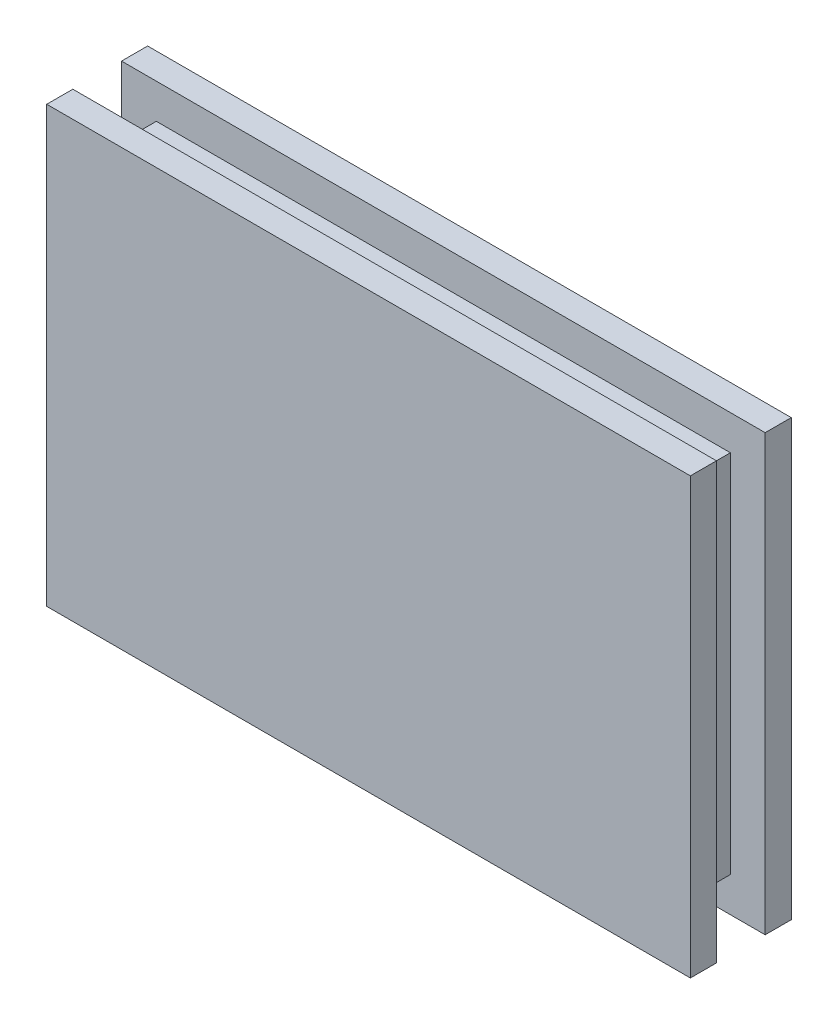
ISO-10303-21;
HEADER;
FILE_DESCRIPTION(('STEP AP214'),'2;1');
FILE_NAME('part.step','',(''),(''),'','','');
FILE_SCHEMA(('AUTOMOTIVE_DESIGN { 1 0 10303 214 1 1 1 1 }'));
ENDSEC;
DATA;
#1=APPLICATION_CONTEXT('core data for automotive mechanical design processes');
#2=APPLICATION_PROTOCOL_DEFINITION('international standard','automotive_design',2000,#1);
#3=PRODUCT_CONTEXT('',#1,'mechanical');
#4=PRODUCT('Part','Part','',(#3));
#5=PRODUCT_RELATED_PRODUCT_CATEGORY('part','',(#4));
#6=PRODUCT_DEFINITION_FORMATION('','',#4);
#7=PRODUCT_DEFINITION_CONTEXT('part definition',#1,'design');
#8=PRODUCT_DEFINITION('design','',#6,#7);
#9=PRODUCT_DEFINITION_SHAPE('','',#8);
#10=(LENGTH_UNIT() NAMED_UNIT(*) SI_UNIT(.MILLI.,.METRE.));
#11=(NAMED_UNIT(*) PLANE_ANGLE_UNIT() SI_UNIT($,.RADIAN.));
#12=(NAMED_UNIT(*) SI_UNIT($,.STERADIAN.) SOLID_ANGLE_UNIT());
#13=UNCERTAINTY_MEASURE_WITH_UNIT(LENGTH_MEASURE(1.E-05),#10,'distance_accuracy_value','');
#14=(GEOMETRIC_REPRESENTATION_CONTEXT(3) GLOBAL_UNCERTAINTY_ASSIGNED_CONTEXT((#13)) GLOBAL_UNIT_ASSIGNED_CONTEXT((#10,
#11,#12)) REPRESENTATION_CONTEXT('',''));
#15=CARTESIAN_POINT('',(0.,0.,0.));
#16=DIRECTION('',(0.,0.,1.));
#17=DIRECTION('',(1.,0.,0.));
#18=AXIS2_PLACEMENT_3D('',#15,#16,#17);
#19=CARTESIAN_POINT('',(-18.5,12.5,1.5));
#20=DIRECTION('',(1.,0.,0.));
#21=DIRECTION('',(0.,0.,-1.));
#22=AXIS2_PLACEMENT_3D('',#19,#20,#21);
#23=PLANE('',#22);
#24=DIRECTION('',(0.,-1.,0.));
#25=VECTOR('',#24,1.);
#26=CARTESIAN_POINT('',(-18.5,12.5,0.));
#27=LINE('',#26,#25);
#28=CARTESIAN_POINT('',(-18.5,12.5,0.));
#29=VERTEX_POINT('',#28);
#30=CARTESIAN_POINT('',(-18.5,-12.5,0.));
#31=VERTEX_POINT('',#30);
#32=EDGE_CURVE('E192',#29,#31,#27,.T.);
#33=ORIENTED_EDGE('',*,*,#32,.T.);
#34=DIRECTION('',(0.,0.,-1.));
#35=VECTOR('',#34,1.);
#36=CARTESIAN_POINT('',(-18.5,-12.5,1.5));
#37=LINE('',#36,#35);
#38=CARTESIAN_POINT('',(-18.5,-12.5,1.5));
#39=VERTEX_POINT('',#38);
#40=EDGE_CURVE('E11',#39,#31,#37,.T.);
#41=ORIENTED_EDGE('',*,*,#40,.F.);
#42=DIRECTION('',(0.,-1.,0.));
#43=VECTOR('',#42,1.);
#44=CARTESIAN_POINT('',(-18.5,12.5,1.5));
#45=LINE('',#44,#43);
#46=CARTESIAN_POINT('',(-18.5,12.5,1.5));
#47=VERTEX_POINT('',#46);
#48=EDGE_CURVE('E193',#47,#39,#45,.T.);
#49=ORIENTED_EDGE('',*,*,#48,.F.);
#50=DIRECTION('',(0.,0.,-1.));
#51=VECTOR('',#50,1.);
#52=CARTESIAN_POINT('',(-18.5,12.5,1.5));
#53=LINE('',#52,#51);
#54=EDGE_CURVE('E203',#47,#29,#53,.T.);
#55=ORIENTED_EDGE('',*,*,#54,.T.);
#56=EDGE_LOOP('',(#33,#41,#49,#55));
#57=FACE_BOUND('',#56,.T.);
#58=ADVANCED_FACE('F33',(#57),#23,.F.);
#59=CARTESIAN_POINT('',(-18.5,-12.5,1.5));
#60=DIRECTION('',(0.,1.,0.));
#61=DIRECTION('',(-1.,0.,0.));
#62=AXIS2_PLACEMENT_3D('',#59,#60,#61);
#63=PLANE('',#62);
#64=DIRECTION('',(1.,0.,0.));
#65=VECTOR('',#64,1.);
#66=CARTESIAN_POINT('',(-18.5,-12.5,0.));
#67=LINE('',#66,#65);
#68=CARTESIAN_POINT('',(18.5,-12.5,0.));
#69=VERTEX_POINT('',#68);
#70=EDGE_CURVE('E206',#31,#69,#67,.T.);
#71=ORIENTED_EDGE('',*,*,#70,.T.);
#72=DIRECTION('',(0.,0.,-1.));
#73=VECTOR('',#72,1.);
#74=CARTESIAN_POINT('',(18.5,-12.5,1.5));
#75=LINE('',#74,#73);
#76=CARTESIAN_POINT('',(18.5,-12.5,1.5));
#77=VERTEX_POINT('',#76);
#78=EDGE_CURVE('E40',#77,#69,#75,.T.);
#79=ORIENTED_EDGE('',*,*,#78,.F.);
#80=DIRECTION('',(1.,0.,0.));
#81=VECTOR('',#80,1.);
#82=CARTESIAN_POINT('',(-18.5,-12.5,1.5));
#83=LINE('',#82,#81);
#84=EDGE_CURVE('E196',#39,#77,#83,.T.);
#85=ORIENTED_EDGE('',*,*,#84,.F.);
#86=ORIENTED_EDGE('',*,*,#40,.T.);
#87=EDGE_LOOP('',(#71,#79,#85,#86));
#88=FACE_BOUND('',#87,.T.);
#89=ADVANCED_FACE('F236',(#88),#63,.F.);
#90=CARTESIAN_POINT('',(18.5,12.5,1.5));
#91=DIRECTION('',(-1.,0.,0.));
#92=DIRECTION('',(0.,0.,1.));
#93=AXIS2_PLACEMENT_3D('',#90,#91,#92);
#94=PLANE('',#93);
#95=DIRECTION('',(0.,1.,0.));
#96=VECTOR('',#95,1.);
#97=CARTESIAN_POINT('',(18.5,12.5,0.));
#98=LINE('',#97,#96);
#99=CARTESIAN_POINT('',(18.5,12.5,0.));
#100=VERTEX_POINT('',#99);
#101=EDGE_CURVE('E208',#69,#100,#98,.T.);
#102=ORIENTED_EDGE('',*,*,#101,.T.);
#103=DIRECTION('',(0.,0.,-1.));
#104=VECTOR('',#103,1.);
#105=CARTESIAN_POINT('',(18.5,12.5,1.5));
#106=LINE('',#105,#104);
#107=CARTESIAN_POINT('',(18.5,12.5,1.5));
#108=VERTEX_POINT('',#107);
#109=EDGE_CURVE('E213',#108,#100,#106,.T.);
#110=ORIENTED_EDGE('',*,*,#109,.F.);
#111=DIRECTION('',(0.,1.,0.));
#112=VECTOR('',#111,1.);
#113=CARTESIAN_POINT('',(18.5,12.5,1.5));
#114=LINE('',#113,#112);
#115=EDGE_CURVE('E199',#77,#108,#114,.T.);
#116=ORIENTED_EDGE('',*,*,#115,.F.);
#117=ORIENTED_EDGE('',*,*,#78,.T.);
#118=EDGE_LOOP('',(#102,#110,#116,#117));
#119=FACE_BOUND('',#118,.T.);
#120=ADVANCED_FACE('F220',(#119),#94,.F.);
#121=CARTESIAN_POINT('',(-18.5,12.5,1.5));
#122=DIRECTION('',(0.,-1.,0.));
#123=DIRECTION('',(0.,0.,-1.));
#124=AXIS2_PLACEMENT_3D('',#121,#122,#123);
#125=PLANE('',#124);
#126=DIRECTION('',(-1.,0.,0.));
#127=VECTOR('',#126,1.);
#128=CARTESIAN_POINT('',(-18.5,12.5,0.));
#129=LINE('',#128,#127);
#130=EDGE_CURVE('E197',#100,#29,#129,.T.);
#131=ORIENTED_EDGE('',*,*,#130,.T.);
#132=ORIENTED_EDGE('',*,*,#54,.F.);
#133=DIRECTION('',(-1.,0.,0.));
#134=VECTOR('',#133,1.);
#135=CARTESIAN_POINT('',(-18.5,12.5,1.5));
#136=LINE('',#135,#134);
#137=EDGE_CURVE('E201',#108,#47,#136,.T.);
#138=ORIENTED_EDGE('',*,*,#137,.F.);
#139=ORIENTED_EDGE('',*,*,#109,.T.);
#140=EDGE_LOOP('',(#131,#132,#138,#139));
#141=FACE_BOUND('',#140,.T.);
#142=ADVANCED_FACE('F229',(#141),#125,.F.);
#143=CARTESIAN_POINT('',(0.,0.,1.5));
#144=DIRECTION('',(0.,0.,1.));
#145=DIRECTION('',(1.,0.,0.));
#146=AXIS2_PLACEMENT_3D('',#143,#144,#145);
#147=PLANE('',#146);
#148=DIRECTION('',(-1.,0.,0.));
#149=VECTOR('',#148,1.);
#150=CARTESIAN_POINT('',(16.5,10.5,1.5));
#151=LINE('',#150,#149);
#152=CARTESIAN_POINT('',(16.5,10.5,1.5));
#153=VERTEX_POINT('',#152);
#154=CARTESIAN_POINT('',(-16.5,10.5,1.5));
#155=VERTEX_POINT('',#154);
#156=EDGE_CURVE('E47',#153,#155,#151,.T.);
#157=ORIENTED_EDGE('',*,*,#156,.F.);
#158=DIRECTION('',(0.,1.,0.));
#159=VECTOR('',#158,1.);
#160=CARTESIAN_POINT('',(16.5,-10.5,1.5));
#161=LINE('',#160,#159);
#162=CARTESIAN_POINT('',(16.5,-10.5,1.5));
#163=VERTEX_POINT('',#162);
#164=EDGE_CURVE('E51',#163,#153,#161,.T.);
#165=ORIENTED_EDGE('',*,*,#164,.F.);
#166=DIRECTION('',(1.,0.,0.));
#167=VECTOR('',#166,1.);
#168=CARTESIAN_POINT('',(-16.5,-10.5,1.5));
#169=LINE('',#168,#167);
#170=CARTESIAN_POINT('',(-16.5,-10.5,1.5));
#171=VERTEX_POINT('',#170);
#172=EDGE_CURVE('E178',#171,#163,#169,.T.);
#173=ORIENTED_EDGE('',*,*,#172,.F.);
#174=DIRECTION('',(0.,-1.,0.));
#175=VECTOR('',#174,1.);
#176=CARTESIAN_POINT('',(-16.5,10.5,1.5));
#177=LINE('',#176,#175);
#178=EDGE_CURVE('E175',#155,#171,#177,.T.);
#179=ORIENTED_EDGE('',*,*,#178,.F.);
#180=EDGE_LOOP('',(#157,#165,#173,#179));
#181=FACE_BOUND('',#180,.T.);
#182=ORIENTED_EDGE('',*,*,#48,.T.);
#183=ORIENTED_EDGE('',*,*,#84,.T.);
#184=ORIENTED_EDGE('',*,*,#115,.T.);
#185=ORIENTED_EDGE('',*,*,#137,.T.);
#186=EDGE_LOOP('',(#182,#183,#184,#185));
#187=FACE_BOUND('',#186,.T.);
#188=ADVANCED_FACE('F235',(#181,#187),#147,.T.);
#189=CARTESIAN_POINT('',(0.,0.,0.));
#190=DIRECTION('',(0.,0.,1.));
#191=DIRECTION('',(1.,0.,0.));
#192=AXIS2_PLACEMENT_3D('',#189,#190,#191);
#193=PLANE('',#192);
#194=ORIENTED_EDGE('',*,*,#32,.F.);
#195=ORIENTED_EDGE('',*,*,#130,.F.);
#196=ORIENTED_EDGE('',*,*,#101,.F.);
#197=ORIENTED_EDGE('',*,*,#70,.F.);
#198=EDGE_LOOP('',(#194,#195,#196,#197));
#199=FACE_BOUND('',#198,.T.);
#200=ADVANCED_FACE('F226',(#199),#193,.F.);
#201=CARTESIAN_POINT('',(16.5,10.5,4.3));
#202=DIRECTION('',(0.,-1.,0.));
#203=DIRECTION('',(0.,0.,-1.));
#204=AXIS2_PLACEMENT_3D('',#201,#202,#203);
#205=PLANE('',#204);
#206=ORIENTED_EDGE('',*,*,#156,.T.);
#207=DIRECTION('',(0.,0.,-1.));
#208=VECTOR('',#207,1.);
#209=CARTESIAN_POINT('',(-16.5,10.5,4.3));
#210=LINE('',#209,#208);
#211=CARTESIAN_POINT('',(-16.5,10.5,4.3));
#212=VERTEX_POINT('',#211);
#213=EDGE_CURVE('E189',#212,#155,#210,.T.);
#214=ORIENTED_EDGE('',*,*,#213,.F.);
#215=DIRECTION('',(-1.,0.,0.));
#216=VECTOR('',#215,1.);
#217=CARTESIAN_POINT('',(16.5,10.5,4.3));
#218=LINE('',#217,#216);
#219=CARTESIAN_POINT('',(16.5,10.5,4.3));
#220=VERTEX_POINT('',#219);
#221=EDGE_CURVE('E161',#220,#212,#218,.T.);
#222=ORIENTED_EDGE('',*,*,#221,.F.);
#223=DIRECTION('',(0.,0.,-1.));
#224=VECTOR('',#223,1.);
#225=CARTESIAN_POINT('',(16.5,10.5,4.3));
#226=LINE('',#225,#224);
#227=EDGE_CURVE('E173',#220,#153,#226,.T.);
#228=ORIENTED_EDGE('',*,*,#227,.T.);
#229=EDGE_LOOP('',(#206,#214,#222,#228));
#230=FACE_BOUND('',#229,.T.);
#231=ADVANCED_FACE('F248',(#230),#205,.F.);
#232=CARTESIAN_POINT('',(-16.5,10.5,4.3));
#233=DIRECTION('',(1.,0.,0.));
#234=DIRECTION('',(0.,0.,-1.));
#235=AXIS2_PLACEMENT_3D('',#232,#233,#234);
#236=PLANE('',#235);
#237=ORIENTED_EDGE('',*,*,#178,.T.);
#238=DIRECTION('',(0.,0.,-1.));
#239=VECTOR('',#238,1.);
#240=CARTESIAN_POINT('',(-16.5,-10.5,4.3));
#241=LINE('',#240,#239);
#242=CARTESIAN_POINT('',(-16.5,-10.5,4.3));
#243=VERTEX_POINT('',#242);
#244=EDGE_CURVE('E186',#243,#171,#241,.T.);
#245=ORIENTED_EDGE('',*,*,#244,.F.);
#246=DIRECTION('',(0.,-1.,0.));
#247=VECTOR('',#246,1.);
#248=CARTESIAN_POINT('',(-16.5,10.5,4.3));
#249=LINE('',#248,#247);
#250=EDGE_CURVE('E164',#212,#243,#249,.T.);
#251=ORIENTED_EDGE('',*,*,#250,.F.);
#252=ORIENTED_EDGE('',*,*,#213,.T.);
#253=EDGE_LOOP('',(#237,#245,#251,#252));
#254=FACE_BOUND('',#253,.T.);
#255=ADVANCED_FACE('F253',(#254),#236,.F.);
#256=CARTESIAN_POINT('',(-16.5,-10.5,4.3));
#257=DIRECTION('',(0.,1.,0.));
#258=DIRECTION('',(-1.,0.,0.));
#259=AXIS2_PLACEMENT_3D('',#256,#257,#258);
#260=PLANE('',#259);
#261=ORIENTED_EDGE('',*,*,#172,.T.);
#262=DIRECTION('',(0.,0.,-1.));
#263=VECTOR('',#262,1.);
#264=CARTESIAN_POINT('',(16.5,-10.5,4.3));
#265=LINE('',#264,#263);
#266=CARTESIAN_POINT('',(16.5,-10.5,4.3));
#267=VERTEX_POINT('',#266);
#268=EDGE_CURVE('E183',#267,#163,#265,.T.);
#269=ORIENTED_EDGE('',*,*,#268,.F.);
#270=DIRECTION('',(1.,0.,0.));
#271=VECTOR('',#270,1.);
#272=CARTESIAN_POINT('',(-16.5,-10.5,4.3));
#273=LINE('',#272,#271);
#274=EDGE_CURVE('E167',#243,#267,#273,.T.);
#275=ORIENTED_EDGE('',*,*,#274,.F.);
#276=ORIENTED_EDGE('',*,*,#244,.T.);
#277=EDGE_LOOP('',(#261,#269,#275,#276));
#278=FACE_BOUND('',#277,.T.);
#279=ADVANCED_FACE('F257',(#278),#260,.F.);
#280=CARTESIAN_POINT('',(16.5,-10.5,4.3));
#281=DIRECTION('',(-1.,0.,0.));
#282=DIRECTION('',(0.,0.,1.));
#283=AXIS2_PLACEMENT_3D('',#280,#281,#282);
#284=PLANE('',#283);
#285=ORIENTED_EDGE('',*,*,#164,.T.);
#286=ORIENTED_EDGE('',*,*,#227,.F.);
#287=DIRECTION('',(0.,1.,0.));
#288=VECTOR('',#287,1.);
#289=CARTESIAN_POINT('',(16.5,-10.5,4.3));
#290=LINE('',#289,#288);
#291=EDGE_CURVE('E170',#267,#220,#290,.T.);
#292=ORIENTED_EDGE('',*,*,#291,.F.);
#293=ORIENTED_EDGE('',*,*,#268,.T.);
#294=EDGE_LOOP('',(#285,#286,#292,#293));
#295=FACE_BOUND('',#294,.T.);
#296=ADVANCED_FACE('F261',(#295),#284,.F.);
#297=CARTESIAN_POINT('',(0.,-12.5,5.8));
#298=DIRECTION('',(0.,-1.,0.));
#299=DIRECTION('',(1.,0.,0.));
#300=AXIS2_PLACEMENT_3D('',#297,#298,#299);
#301=PLANE('',#300);
#302=DIRECTION('',(-1.,0.,0.));
#303=VECTOR('',#302,1.);
#304=CARTESIAN_POINT('',(0.,-12.5,4.3));
#305=LINE('',#304,#303);
#306=CARTESIAN_POINT('',(18.5,-12.5,4.3));
#307=VERTEX_POINT('',#306);
#308=CARTESIAN_POINT('',(-18.5,-12.5,4.3));
#309=VERTEX_POINT('',#308);
#310=EDGE_CURVE('E152',#307,#309,#305,.T.);
#311=ORIENTED_EDGE('',*,*,#310,.F.);
#312=DIRECTION('',(0.,0.,-1.));
#313=VECTOR('',#312,1.);
#314=CARTESIAN_POINT('',(18.5,-12.5,5.8));
#315=LINE('',#314,#313);
#316=CARTESIAN_POINT('',(18.5,-12.5,5.8));
#317=VERTEX_POINT('',#316);
#318=EDGE_CURVE('E143',#317,#307,#315,.T.);
#319=ORIENTED_EDGE('',*,*,#318,.F.);
#320=DIRECTION('',(-1.,0.,0.));
#321=VECTOR('',#320,1.);
#322=CARTESIAN_POINT('',(0.,-12.5,5.8));
#323=LINE('',#322,#321);
#324=CARTESIAN_POINT('',(-18.5,-12.5,5.8));
#325=VERTEX_POINT('',#324);
#326=EDGE_CURVE('E137',#317,#325,#323,.T.);
#327=ORIENTED_EDGE('',*,*,#326,.T.);
#328=DIRECTION('',(0.,0.,-1.));
#329=VECTOR('',#328,1.);
#330=CARTESIAN_POINT('',(-18.5,-12.5,5.8));
#331=LINE('',#330,#329);
#332=EDGE_CURVE('E119',#325,#309,#331,.T.);
#333=ORIENTED_EDGE('',*,*,#332,.T.);
#334=EDGE_LOOP('',(#311,#319,#327,#333));
#335=FACE_BOUND('',#334,.T.);
#336=ADVANCED_FACE('F142',(#335),#301,.T.);
#337=CARTESIAN_POINT('',(18.5,0.,5.8));
#338=DIRECTION('',(1.,0.,0.));
#339=DIRECTION('',(0.,0.,-1.));
#340=AXIS2_PLACEMENT_3D('',#337,#338,#339);
#341=PLANE('',#340);
#342=DIRECTION('',(0.,-1.,0.));
#343=VECTOR('',#342,1.);
#344=CARTESIAN_POINT('',(18.5,0.,4.3));
#345=LINE('',#344,#343);
#346=CARTESIAN_POINT('',(18.5,12.5,4.3));
#347=VERTEX_POINT('',#346);
#348=EDGE_CURVE('E144',#347,#307,#345,.T.);
#349=ORIENTED_EDGE('',*,*,#348,.F.);
#350=DIRECTION('',(0.,0.,-1.));
#351=VECTOR('',#350,1.);
#352=CARTESIAN_POINT('',(18.5,12.5,5.8));
#353=LINE('',#352,#351);
#354=CARTESIAN_POINT('',(18.5,12.5,5.8));
#355=VERTEX_POINT('',#354);
#356=EDGE_CURVE('E158',#355,#347,#353,.T.);
#357=ORIENTED_EDGE('',*,*,#356,.F.);
#358=DIRECTION('',(0.,-1.,0.));
#359=VECTOR('',#358,1.);
#360=CARTESIAN_POINT('',(18.5,0.,5.8));
#361=LINE('',#360,#359);
#362=EDGE_CURVE('E130',#355,#317,#361,.T.);
#363=ORIENTED_EDGE('',*,*,#362,.T.);
#364=ORIENTED_EDGE('',*,*,#318,.T.);
#365=EDGE_LOOP('',(#349,#357,#363,#364));
#366=FACE_BOUND('',#365,.T.);
#367=ADVANCED_FACE('F268',(#366),#341,.T.);
#368=CARTESIAN_POINT('',(0.,12.5,5.8));
#369=DIRECTION('',(0.,1.,0.));
#370=DIRECTION('',(0.,0.,1.));
#371=AXIS2_PLACEMENT_3D('',#368,#369,#370);
#372=PLANE('',#371);
#373=DIRECTION('',(1.,0.,0.));
#374=VECTOR('',#373,1.);
#375=CARTESIAN_POINT('',(0.,12.5,4.3));
#376=LINE('',#375,#374);
#377=CARTESIAN_POINT('',(-18.5,12.5,4.3));
#378=VERTEX_POINT('',#377);
#379=EDGE_CURVE('E147',#378,#347,#376,.T.);
#380=ORIENTED_EDGE('',*,*,#379,.F.);
#381=DIRECTION('',(0.,0.,-1.));
#382=VECTOR('',#381,1.);
#383=CARTESIAN_POINT('',(-18.5,12.5,5.8));
#384=LINE('',#383,#382);
#385=CARTESIAN_POINT('',(-18.5,12.5,5.8));
#386=VERTEX_POINT('',#385);
#387=EDGE_CURVE('E129',#386,#378,#384,.T.);
#388=ORIENTED_EDGE('',*,*,#387,.F.);
#389=DIRECTION('',(1.,0.,0.));
#390=VECTOR('',#389,1.);
#391=CARTESIAN_POINT('',(0.,12.5,5.8));
#392=LINE('',#391,#390);
#393=EDGE_CURVE('E140',#386,#355,#392,.T.);
#394=ORIENTED_EDGE('',*,*,#393,.T.);
#395=ORIENTED_EDGE('',*,*,#356,.T.);
#396=EDGE_LOOP('',(#380,#388,#394,#395));
#397=FACE_BOUND('',#396,.T.);
#398=ADVANCED_FACE('F271',(#397),#372,.T.);
#399=CARTESIAN_POINT('',(-18.5,0.,5.8));
#400=DIRECTION('',(-1.,0.,0.));
#401=DIRECTION('',(0.,0.,1.));
#402=AXIS2_PLACEMENT_3D('',#399,#400,#401);
#403=PLANE('',#402);
#404=DIRECTION('',(0.,1.,0.));
#405=VECTOR('',#404,1.);
#406=CARTESIAN_POINT('',(-18.5,0.,4.3));
#407=LINE('',#406,#405);
#408=EDGE_CURVE('E124',#309,#378,#407,.T.);
#409=ORIENTED_EDGE('',*,*,#408,.F.);
#410=ORIENTED_EDGE('',*,*,#332,.F.);
#411=DIRECTION('',(0.,1.,0.));
#412=VECTOR('',#411,1.);
#413=CARTESIAN_POINT('',(-18.5,0.,5.8));
#414=LINE('',#413,#412);
#415=EDGE_CURVE('E122',#325,#386,#414,.T.);
#416=ORIENTED_EDGE('',*,*,#415,.T.);
#417=ORIENTED_EDGE('',*,*,#387,.T.);
#418=EDGE_LOOP('',(#409,#410,#416,#417));
#419=FACE_BOUND('',#418,.T.);
#420=ADVANCED_FACE('F121',(#419),#403,.T.);
#421=CARTESIAN_POINT('',(0.,0.,5.8));
#422=DIRECTION('',(0.,0.,-1.));
#423=DIRECTION('',(-1.,0.,0.));
#424=AXIS2_PLACEMENT_3D('',#421,#422,#423);
#425=PLANE('',#424);
#426=ORIENTED_EDGE('',*,*,#326,.F.);
#427=ORIENTED_EDGE('',*,*,#362,.F.);
#428=ORIENTED_EDGE('',*,*,#393,.F.);
#429=ORIENTED_EDGE('',*,*,#415,.F.);
#430=EDGE_LOOP('',(#426,#427,#428,#429));
#431=FACE_BOUND('',#430,.T.);
#432=ADVANCED_FACE('F135',(#431),#425,.F.);
#433=CARTESIAN_POINT('',(0.,0.,4.3));
#434=DIRECTION('',(0.,0.,-1.));
#435=DIRECTION('',(-1.,0.,0.));
#436=AXIS2_PLACEMENT_3D('',#433,#434,#435);
#437=PLANE('',#436);
#438=ORIENTED_EDGE('',*,*,#291,.T.);
#439=ORIENTED_EDGE('',*,*,#221,.T.);
#440=ORIENTED_EDGE('',*,*,#250,.T.);
#441=ORIENTED_EDGE('',*,*,#274,.T.);
#442=EDGE_LOOP('',(#438,#439,#440,#441));
#443=FACE_BOUND('',#442,.T.);
#444=ORIENTED_EDGE('',*,*,#310,.T.);
#445=ORIENTED_EDGE('',*,*,#408,.T.);
#446=ORIENTED_EDGE('',*,*,#379,.T.);
#447=ORIENTED_EDGE('',*,*,#348,.T.);
#448=EDGE_LOOP('',(#444,#445,#446,#447));
#449=FACE_BOUND('',#448,.T.);
#450=ADVANCED_FACE('F278',(#443,#449),#437,.T.);
#451=CLOSED_SHELL('',(#58,#89,#120,#142,#188,#200,#231,#255,#279,#296,#336,#367,#398,#420,#432,#450));
#452=MANIFOLD_SOLID_BREP('B2',#451);
#453=ADVANCED_BREP_SHAPE_REPRESENTATION('',(#18,#452),#14);
#454=SHAPE_DEFINITION_REPRESENTATION(#9,#453);
ENDSEC;
END-ISO-10303-21;
